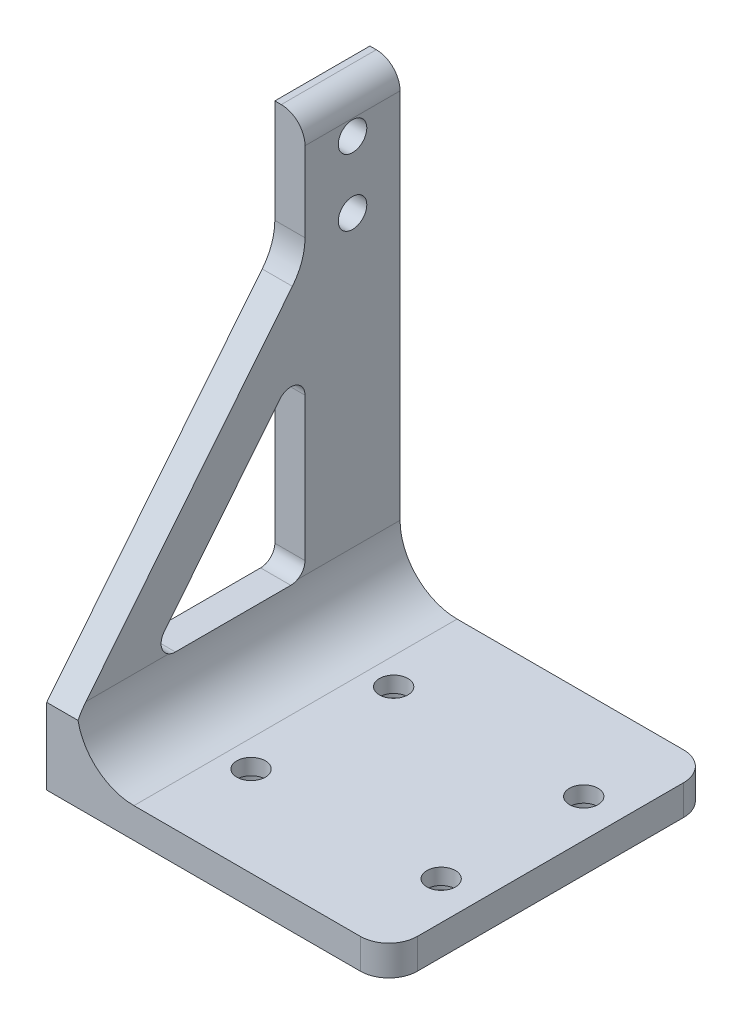
ISO-10303-21;
HEADER;
FILE_DESCRIPTION(('STEP AP214'),'2;1');
FILE_NAME('part.step','',(''),(''),'','','');
FILE_SCHEMA(('AUTOMOTIVE_DESIGN { 1 0 10303 214 1 1 1 1 }'));
ENDSEC;
DATA;
#1=APPLICATION_CONTEXT('core data for automotive mechanical design processes');
#2=APPLICATION_PROTOCOL_DEFINITION('international standard','automotive_design',2000,#1);
#3=PRODUCT_CONTEXT('',#1,'mechanical');
#4=PRODUCT('Part','Part','',(#3));
#5=PRODUCT_RELATED_PRODUCT_CATEGORY('part','',(#4));
#6=PRODUCT_DEFINITION_FORMATION('','',#4);
#7=PRODUCT_DEFINITION_CONTEXT('part definition',#1,'design');
#8=PRODUCT_DEFINITION('design','',#6,#7);
#9=PRODUCT_DEFINITION_SHAPE('','',#8);
#10=(LENGTH_UNIT() NAMED_UNIT(*) SI_UNIT(.MILLI.,.METRE.));
#11=(NAMED_UNIT(*) PLANE_ANGLE_UNIT() SI_UNIT($,.RADIAN.));
#12=(NAMED_UNIT(*) SI_UNIT($,.STERADIAN.) SOLID_ANGLE_UNIT());
#13=UNCERTAINTY_MEASURE_WITH_UNIT(LENGTH_MEASURE(1.E-05),#10,'distance_accuracy_value','');
#14=(GEOMETRIC_REPRESENTATION_CONTEXT(3) GLOBAL_UNCERTAINTY_ASSIGNED_CONTEXT((#13)) GLOBAL_UNIT_ASSIGNED_CONTEXT((#10,
#11,#12)) REPRESENTATION_CONTEXT('',''));
#15=CARTESIAN_POINT('',(0.,0.,0.));
#16=DIRECTION('',(0.,0.,1.));
#17=DIRECTION('',(1.,0.,0.));
#18=AXIS2_PLACEMENT_3D('',#15,#16,#17);
#19=CARTESIAN_POINT('',(0.,0.,-17.));
#20=DIRECTION('',(-1.,0.,0.));
#21=DIRECTION('',(0.,0.,1.));
#22=AXIS2_PLACEMENT_3D('',#19,#20,#21);
#23=PLANE('',#22);
#24=CARTESIAN_POINT('',(0.,39.6749994050729,-12.));
#25=DIRECTION('',(-1.,0.,0.));
#26=DIRECTION('',(0.,0.,1.));
#27=AXIS2_PLACEMENT_3D('',#24,#25,#26);
#28=CIRCLE('',#27,1.5);
#29=CARTESIAN_POINT('',(0.,39.6749994050729,-10.5));
#30=VERTEX_POINT('',#29);
#31=EDGE_CURVE('E477',#30,#30,#28,.T.);
#32=ORIENTED_EDGE('',*,*,#31,.F.);
#33=EDGE_LOOP('',(#32));
#34=FACE_BOUND('',#33,.T.);
#35=CARTESIAN_POINT('',(0.,46.6749994050729,-12.));
#36=DIRECTION('',(-1.,0.,0.));
#37=DIRECTION('',(0.,0.,1.));
#38=AXIS2_PLACEMENT_3D('',#35,#36,#37);
#39=CIRCLE('',#38,1.5);
#40=CARTESIAN_POINT('',(0.,46.6749994050729,-10.5));
#41=VERTEX_POINT('',#40);
#42=EDGE_CURVE('E474',#41,#41,#39,.T.);
#43=ORIENTED_EDGE('',*,*,#42,.F.);
#44=EDGE_LOOP('',(#43));
#45=FACE_BOUND('',#44,.T.);
#46=DIRECTION('',(0.,0.778824836888192,-0.627241479373041));
#47=VECTOR('',#46,1.);
#48=CARTESIAN_POINT('',(0.,29.8285884074539,-7.));
#49=LINE('',#48,#47);
#50=CARTESIAN_POINT('',(0.,11.4408622190596,7.8089069973646));
#51=VERTEX_POINT('',#50);
#52=CARTESIAN_POINT('',(0.,26.5155271487497,-4.33176274466771));
#53=VERTEX_POINT('',#52);
#54=EDGE_CURVE('E470',#51,#53,#49,.T.);
#55=ORIENTED_EDGE('',*,*,#54,.F.);
#56=CARTESIAN_POINT('',(0.,10.5,6.64066974203231));
#57=DIRECTION('',(-1.,0.,0.));
#58=DIRECTION('',(0.,0.,1.));
#59=AXIS2_PLACEMENT_3D('',#56,#57,#58);
#60=CIRCLE('',#59,1.5);
#61=CARTESIAN_POINT('',(0.,9.,6.64066974203231));
#62=VERTEX_POINT('',#61);
#63=EDGE_CURVE('E320',#51,#62,#60,.F.);
#64=ORIENTED_EDGE('',*,*,#63,.T.);
#65=DIRECTION('',(0.,0.,1.));
#66=VECTOR('',#65,1.);
#67=CARTESIAN_POINT('',(0.,9.,-7.));
#68=LINE('',#67,#66);
#69=CARTESIAN_POINT('',(0.,9.,-5.5));
#70=VERTEX_POINT('',#69);
#71=EDGE_CURVE('E464',#70,#62,#68,.T.);
#72=ORIENTED_EDGE('',*,*,#71,.F.);
#73=CARTESIAN_POINT('',(0.,10.5,-5.5));
#74=DIRECTION('',(-1.,0.,0.));
#75=DIRECTION('',(0.,0.,1.));
#76=AXIS2_PLACEMENT_3D('',#73,#74,#75);
#77=CIRCLE('',#76,1.5);
#78=CARTESIAN_POINT('',(0.,10.5,-7.));
#79=VERTEX_POINT('',#78);
#80=EDGE_CURVE('E501',#70,#79,#77,.F.);
#81=ORIENTED_EDGE('',*,*,#80,.T.);
#82=DIRECTION('',(0.,-1.,0.));
#83=VECTOR('',#82,1.);
#84=CARTESIAN_POINT('',(0.,29.8285884074539,-7.));
#85=LINE('',#84,#83);
#86=CARTESIAN_POINT('',(0.,25.5746649296901,-7.));
#87=VERTEX_POINT('',#86);
#88=EDGE_CURVE('E467',#87,#79,#85,.T.);
#89=ORIENTED_EDGE('',*,*,#88,.F.);
#90=CARTESIAN_POINT('',(0.,25.5746649296901,-5.5));
#91=DIRECTION('',(-1.,0.,0.));
#92=DIRECTION('',(0.,0.,1.));
#93=AXIS2_PLACEMENT_3D('',#90,#91,#92);
#94=CIRCLE('',#93,1.5);
#95=EDGE_CURVE('E316',#87,#53,#94,.F.);
#96=ORIENTED_EDGE('',*,*,#95,.T.);
#97=EDGE_LOOP('',(#55,#64,#72,#81,#89,#96));
#98=FACE_BOUND('',#97,.T.);
#99=DIRECTION('',(0.,-1.,0.));
#100=VECTOR('',#99,1.);
#101=CARTESIAN_POINT('',(0.,0.,17.));
#102=LINE('',#101,#100);
#103=CARTESIAN_POINT('',(0.,8.,17.));
#104=VERTEX_POINT('',#103);
#105=CARTESIAN_POINT('',(0.,0.,17.));
#106=VERTEX_POINT('',#105);
#107=EDGE_CURVE('E188',#104,#106,#102,.T.);
#108=ORIENTED_EDGE('',*,*,#107,.F.);
#109=DIRECTION('',(0.,-0.778824836888192,0.627241479373041));
#110=VECTOR('',#109,1.);
#111=CARTESIAN_POINT('',(0.,37.8,-7.));
#112=LINE('',#111,#110);
#113=CARTESIAN_POINT('',(0.,36.152245034817,-5.67294902132915));
#114=VERTEX_POINT('',#113);
#115=EDGE_CURVE('E170',#114,#104,#112,.T.);
#116=ORIENTED_EDGE('',*,*,#115,.F.);
#117=CARTESIAN_POINT('',(0.,39.9156939110553,-1.));
#118=DIRECTION('',(-1.,0.,0.));
#119=DIRECTION('',(0.,0.,1.));
#120=AXIS2_PLACEMENT_3D('',#117,#118,#119);
#121=CIRCLE('',#120,6.);
#122=CARTESIAN_POINT('',(0.,39.9156939110553,-7.));
#123=VERTEX_POINT('',#122);
#124=EDGE_CURVE('E296',#114,#123,#121,.F.);
#125=ORIENTED_EDGE('',*,*,#124,.T.);
#126=DIRECTION('',(0.,-1.,0.));
#127=VECTOR('',#126,1.);
#128=CARTESIAN_POINT('',(0.,50.8,-7.));
#129=LINE('',#128,#127);
#130=CARTESIAN_POINT('',(0.,50.8,-7.));
#131=VERTEX_POINT('',#130);
#132=EDGE_CURVE('E182',#131,#123,#129,.T.);
#133=ORIENTED_EDGE('',*,*,#132,.F.);
#134=DIRECTION('',(0.,0.,1.));
#135=VECTOR('',#134,1.);
#136=CARTESIAN_POINT('',(0.,50.8,-17.));
#137=LINE('',#136,#135);
#138=CARTESIAN_POINT('',(0.,50.8,-17.));
#139=VERTEX_POINT('',#138);
#140=EDGE_CURVE('E218',#139,#131,#137,.T.);
#141=ORIENTED_EDGE('',*,*,#140,.F.);
#142=DIRECTION('',(0.,-1.,0.));
#143=VECTOR('',#142,1.);
#144=CARTESIAN_POINT('',(0.,0.,-17.));
#145=LINE('',#144,#143);
#146=CARTESIAN_POINT('',(0.,0.,-17.));
#147=VERTEX_POINT('',#146);
#148=EDGE_CURVE('E213',#139,#147,#145,.T.);
#149=ORIENTED_EDGE('',*,*,#148,.T.);
#150=DIRECTION('',(0.,0.,1.));
#151=VECTOR('',#150,1.);
#152=CARTESIAN_POINT('',(0.,0.,-17.));
#153=LINE('',#152,#151);
#154=EDGE_CURVE('E195',#147,#106,#153,.T.);
#155=ORIENTED_EDGE('',*,*,#154,.T.);
#156=EDGE_LOOP('',(#108,#116,#125,#133,#141,#149,#155));
#157=FACE_BOUND('',#156,.T.);
#158=ADVANCED_FACE('F32',(#34,#45,#98,#157),#23,.T.);
#159=CARTESIAN_POINT('',(0.,50.8,-17.));
#160=DIRECTION('',(0.,1.,0.));
#161=DIRECTION('',(0.,0.,1.));
#162=AXIS2_PLACEMENT_3D('',#159,#160,#161);
#163=PLANE('',#162);
#164=ORIENTED_EDGE('',*,*,#140,.T.);
#165=DIRECTION('',(1.,0.,0.));
#166=VECTOR('',#165,1.);
#167=CARTESIAN_POINT('',(-103.676377914301,50.8,-7.));
#168=LINE('',#167,#166);
#169=CARTESIAN_POINT('',(0.674999999999967,50.8,-7.));
#170=VERTEX_POINT('',#169);
#171=EDGE_CURVE('E192',#131,#170,#168,.T.);
#172=ORIENTED_EDGE('',*,*,#171,.T.);
#173=DIRECTION('',(0.,0.,1.));
#174=VECTOR('',#173,1.);
#175=CARTESIAN_POINT('',(0.675,50.8,-17.));
#176=LINE('',#175,#174);
#177=CARTESIAN_POINT('',(0.675,50.8,-17.));
#178=VERTEX_POINT('',#177);
#179=EDGE_CURVE('E236',#170,#178,#176,.F.);
#180=ORIENTED_EDGE('',*,*,#179,.T.);
#181=DIRECTION('',(-1.,0.,0.));
#182=VECTOR('',#181,1.);
#183=CARTESIAN_POINT('',(0.,50.8,-17.));
#184=LINE('',#183,#182);
#185=EDGE_CURVE('E211',#178,#139,#184,.T.);
#186=ORIENTED_EDGE('',*,*,#185,.T.);
#187=EDGE_LOOP('',(#164,#172,#180,#186));
#188=FACE_BOUND('',#187,.T.);
#189=ADVANCED_FACE('F370',(#188),#163,.T.);
#190=CARTESIAN_POINT('',(3.175,3.175,-17.));
#191=DIRECTION('',(1.,0.,0.));
#192=DIRECTION('',(0.,0.,-1.));
#193=AXIS2_PLACEMENT_3D('',#190,#191,#192);
#194=PLANE('',#193);
#195=CARTESIAN_POINT('',(3.175,39.6749994050729,-12.));
#196=DIRECTION('',(1.,0.,0.));
#197=DIRECTION('',(0.,0.,-1.));
#198=AXIS2_PLACEMENT_3D('',#195,#196,#197);
#199=CIRCLE('',#198,1.5);
#200=CARTESIAN_POINT('',(3.175,39.6749994050729,-13.5));
#201=VERTEX_POINT('',#200);
#202=EDGE_CURVE('E37',#201,#201,#199,.T.);
#203=ORIENTED_EDGE('',*,*,#202,.F.);
#204=EDGE_LOOP('',(#203));
#205=FACE_BOUND('',#204,.T.);
#206=CARTESIAN_POINT('',(3.175,46.6749994050729,-12.));
#207=DIRECTION('',(1.,0.,0.));
#208=DIRECTION('',(0.,0.,-1.));
#209=AXIS2_PLACEMENT_3D('',#206,#207,#208);
#210=CIRCLE('',#209,1.5);
#211=CARTESIAN_POINT('',(3.175,46.6749994050729,-13.5));
#212=VERTEX_POINT('',#211);
#213=EDGE_CURVE('E473',#212,#212,#210,.T.);
#214=ORIENTED_EDGE('',*,*,#213,.F.);
#215=EDGE_LOOP('',(#214));
#216=FACE_BOUND('',#215,.T.);
#217=DIRECTION('',(0.,-0.778824836888192,0.627241479373041));
#218=VECTOR('',#217,1.);
#219=CARTESIAN_POINT('',(3.175,18.5464836498275,2.08625886520249));
#220=LINE('',#219,#218);
#221=CARTESIAN_POINT('',(3.175,26.5155271487497,-4.33176274466771));
#222=VERTEX_POINT('',#221);
#223=CARTESIAN_POINT('',(3.175,11.4408622190596,7.8089069973646));
#224=VERTEX_POINT('',#223);
#225=EDGE_CURVE('E456',#222,#224,#220,.T.);
#226=ORIENTED_EDGE('',*,*,#225,.F.);
#227=CARTESIAN_POINT('',(3.175,25.5746649296901,-5.5));
#228=DIRECTION('',(1.,0.,0.));
#229=DIRECTION('',(0.,0.,-1.));
#230=AXIS2_PLACEMENT_3D('',#227,#228,#229);
#231=CIRCLE('',#230,1.5);
#232=CARTESIAN_POINT('',(3.175,25.5746649296901,-7.));
#233=VERTEX_POINT('',#232);
#234=EDGE_CURVE('E318',#222,#233,#231,.F.);
#235=ORIENTED_EDGE('',*,*,#234,.T.);
#236=DIRECTION('',(0.,1.,0.));
#237=VECTOR('',#236,1.);
#238=CARTESIAN_POINT('',(3.175,3.175,-7.));
#239=LINE('',#238,#237);
#240=CARTESIAN_POINT('',(3.175,10.5,-7.));
#241=VERTEX_POINT('',#240);
#242=EDGE_CURVE('E461',#241,#233,#239,.T.);
#243=ORIENTED_EDGE('',*,*,#242,.F.);
#244=CARTESIAN_POINT('',(3.175,10.5,-5.5));
#245=DIRECTION('',(1.,0.,0.));
#246=DIRECTION('',(0.,0.,-1.));
#247=AXIS2_PLACEMENT_3D('',#244,#245,#246);
#248=CIRCLE('',#247,1.5);
#249=CARTESIAN_POINT('',(3.175,9.175,-6.20311805552126));
#250=VERTEX_POINT('',#249);
#251=EDGE_CURVE('E42',#241,#250,#248,.F.);
#252=ORIENTED_EDGE('',*,*,#251,.T.);
#253=DIRECTION('',(0.,0.,1.));
#254=VECTOR('',#253,1.);
#255=CARTESIAN_POINT('',(3.175,9.175,-17.));
#256=LINE('',#255,#254);
#257=CARTESIAN_POINT('',(3.175,9.175,-17.));
#258=VERTEX_POINT('',#257);
#259=EDGE_CURVE('E49',#250,#258,#256,.F.);
#260=ORIENTED_EDGE('',*,*,#259,.T.);
#261=DIRECTION('',(0.,1.,0.));
#262=VECTOR('',#261,1.);
#263=CARTESIAN_POINT('',(3.175,3.175,-17.));
#264=LINE('',#263,#262);
#265=CARTESIAN_POINT('',(3.175,48.3,-17.));
#266=VERTEX_POINT('',#265);
#267=EDGE_CURVE('E208',#258,#266,#264,.T.);
#268=ORIENTED_EDGE('',*,*,#267,.T.);
#269=DIRECTION('',(0.,0.,1.));
#270=VECTOR('',#269,1.);
#271=CARTESIAN_POINT('',(3.175,48.3,-17.));
#272=LINE('',#271,#270);
#273=CARTESIAN_POINT('',(3.175,48.3,-7.));
#274=VERTEX_POINT('',#273);
#275=EDGE_CURVE('E233',#266,#274,#272,.T.);
#276=ORIENTED_EDGE('',*,*,#275,.T.);
#277=DIRECTION('',(0.,-1.,0.));
#278=VECTOR('',#277,1.);
#279=CARTESIAN_POINT('',(3.175,3.175,-6.99999999999999));
#280=LINE('',#279,#278);
#281=CARTESIAN_POINT('',(3.175,39.9156939110553,-7.));
#282=VERTEX_POINT('',#281);
#283=EDGE_CURVE('E451',#274,#282,#280,.T.);
#284=ORIENTED_EDGE('',*,*,#283,.T.);
#285=CARTESIAN_POINT('',(3.175,39.9156939110553,-1.));
#286=DIRECTION('',(1.,0.,0.));
#287=DIRECTION('',(0.,0.,-1.));
#288=AXIS2_PLACEMENT_3D('',#285,#286,#287);
#289=CIRCLE('',#288,6.);
#290=CARTESIAN_POINT('',(3.175,36.152245034817,-5.67294902132915));
#291=VERTEX_POINT('',#290);
#292=EDGE_CURVE('E294',#282,#291,#289,.F.);
#293=ORIENTED_EDGE('',*,*,#292,.T.);
#294=DIRECTION('',(0.,-0.778824836888192,0.627241479373041));
#295=VECTOR('',#294,1.);
#296=CARTESIAN_POINT('',(3.175,21.6826910466927,5.98038304964345));
#297=LINE('',#296,#295);
#298=CARTESIAN_POINT('',(3.175,9.175,16.0536912751678));
#299=VERTEX_POINT('',#298);
#300=EDGE_CURVE('E440',#291,#299,#297,.T.);
#301=ORIENTED_EDGE('',*,*,#300,.T.);
#302=CARTESIAN_POINT('',(3.175,9.175,7.34378779755363));
#303=VERTEX_POINT('',#302);
#304=EDGE_CURVE('E57',#299,#303,#256,.F.);
#305=ORIENTED_EDGE('',*,*,#304,.T.);
#306=CARTESIAN_POINT('',(3.175,10.5,6.64066974203231));
#307=DIRECTION('',(1.,0.,0.));
#308=DIRECTION('',(0.,0.,-1.));
#309=AXIS2_PLACEMENT_3D('',#306,#307,#308);
#310=CIRCLE('',#309,1.5);
#311=EDGE_CURVE('E328',#303,#224,#310,.F.);
#312=ORIENTED_EDGE('',*,*,#311,.T.);
#313=EDGE_LOOP('',(#226,#235,#243,#252,#260,#268,#276,#284,#293,#301,#305,#312));
#314=FACE_BOUND('',#313,.T.);
#315=ADVANCED_FACE('F376',(#205,#216,#314),#194,.T.);
#316=CARTESIAN_POINT('',(0.,0.,17.));
#317=DIRECTION('',(0.,0.,1.));
#318=DIRECTION('',(1.,0.,0.));
#319=AXIS2_PLACEMENT_3D('',#316,#317,#318);
#320=PLANE('',#319);
#321=DIRECTION('',(1.,0.,0.));
#322=VECTOR('',#321,1.);
#323=CARTESIAN_POINT('',(0.,0.,17.));
#324=LINE('',#323,#322);
#325=CARTESIAN_POINT('',(33.,0.,17.));
#326=VERTEX_POINT('',#325);
#327=EDGE_CURVE('E203',#106,#326,#324,.T.);
#328=ORIENTED_EDGE('',*,*,#327,.T.);
#329=DIRECTION('',(0.,1.,0.));
#330=VECTOR('',#329,1.);
#331=CARTESIAN_POINT('',(33.,0.,17.));
#332=LINE('',#331,#330);
#333=CARTESIAN_POINT('',(33.,3.175,17.));
#334=VERTEX_POINT('',#333);
#335=EDGE_CURVE('E287',#326,#334,#332,.T.);
#336=ORIENTED_EDGE('',*,*,#335,.T.);
#337=DIRECTION('',(-1.,0.,0.));
#338=VECTOR('',#337,1.);
#339=CARTESIAN_POINT('',(3.175,3.175,17.));
#340=LINE('',#339,#338);
#341=CARTESIAN_POINT('',(9.175,3.175,17.));
#342=VERTEX_POINT('',#341);
#343=EDGE_CURVE('E198',#334,#342,#340,.T.);
#344=ORIENTED_EDGE('',*,*,#343,.T.);
#345=CARTESIAN_POINT('',(9.175,9.175,17.));
#346=DIRECTION('',(0.,0.,1.));
#347=DIRECTION('',(1.,0.,0.));
#348=AXIS2_PLACEMENT_3D('',#345,#346,#347);
#349=CIRCLE('',#348,6.);
#350=CARTESIAN_POINT('',(3.29117683814341,8.,17.));
#351=VERTEX_POINT('',#350);
#352=EDGE_CURVE('E191',#342,#351,#349,.F.);
#353=ORIENTED_EDGE('',*,*,#352,.T.);
#354=DIRECTION('',(1.,0.,0.));
#355=VECTOR('',#354,1.);
#356=CARTESIAN_POINT('',(-103.676377914301,8.,17.));
#357=LINE('',#356,#355);
#358=EDGE_CURVE('E175',#104,#351,#357,.T.);
#359=ORIENTED_EDGE('',*,*,#358,.F.);
#360=ORIENTED_EDGE('',*,*,#107,.T.);
#361=EDGE_LOOP('',(#328,#336,#344,#353,#359,#360));
#362=FACE_BOUND('',#361,.T.);
#363=ADVANCED_FACE('F187',(#362),#320,.T.);
#364=CARTESIAN_POINT('',(9.175,9.175,-17.));
#365=DIRECTION('',(0.,0.,-1.));
#366=DIRECTION('',(-1.,0.,0.));
#367=AXIS2_PLACEMENT_3D('',#364,#365,#366);
#368=CYLINDRICAL_SURFACE('',#367,6.);
#369=ORIENTED_EDGE('',*,*,#259,.F.);
#370=CARTESIAN_POINT('',(3.175,9.175,-6.20311805552126));
#371=CARTESIAN_POINT('',(3.17500145071679,9.15503001076075,-6.16548060358391));
#372=CARTESIAN_POINT('',(3.17509938942733,9.13667432534819,-6.12701820510613));
#373=CARTESIAN_POINT('',(3.17540509413307,9.1032922326386,-6.04865836708274));
#374=CARTESIAN_POINT('',(3.17561290105218,9.08826706886206,-6.00876039797736));
#375=CARTESIAN_POINT('',(3.17626678804146,9.04892250005548,-5.88899390782853));
#376=CARTESIAN_POINT('',(3.17675047274568,9.0294818561759,-5.80743759010175));
#377=CARTESIAN_POINT('',(3.17723042678405,9.01134011409029,-5.68789641267283));
#378=CARTESIAN_POINT('',(3.17734842314909,9.00711360072616,-5.650655796217));
#379=CARTESIAN_POINT('',(3.17751052579856,9.00143196734003,-5.57561930827016));
#380=CARTESIAN_POINT('',(3.17755394317767,9.00000266925612,-5.53782147899572));
#381=CARTESIAN_POINT('',(3.1775526263251,9.,-5.5));
#382=B_SPLINE_CURVE_WITH_KNOTS('',3,(#370,#371,#372,#373,#374,#375,#376,#377,#378,#379,#380,
#381),.UNSPECIFIED.,.F.,.F.,(4,2,2,2,2,4),(0.,0.127727456084482,0.255502521878572,
0.505640795183576,0.617998612886143,0.731388836392833),.UNSPECIFIED.);
#383=CARTESIAN_POINT('',(3.1775526263251,9.,-5.5));
#384=VERTEX_POINT('',#383);
#385=EDGE_CURVE('E11',#250,#384,#382,.T.);
#386=ORIENTED_EDGE('',*,*,#385,.T.);
#387=DIRECTION('',(0.,0.,-1.));
#388=VECTOR('',#387,1.);
#389=CARTESIAN_POINT('',(3.1775526263251,9.,-17.));
#390=LINE('',#389,#388);
#391=CARTESIAN_POINT('',(3.1775526263251,9.,6.64066974203231));
#392=VERTEX_POINT('',#391);
#393=EDGE_CURVE('E298',#384,#392,#390,.F.);
#394=ORIENTED_EDGE('',*,*,#393,.T.);
#395=CARTESIAN_POINT('',(3.1775526263251,9.,6.64066974203231));
#396=CARTESIAN_POINT('',(3.17755524271252,9.00000220015622,6.68327679782795));
#397=CARTESIAN_POINT('',(3.17749931275558,9.00181708722707,6.72585609912429));
#398=CARTESIAN_POINT('',(3.17729348031295,9.00906040652486,6.81072179512134));
#399=CARTESIAN_POINT('',(3.17714354298612,9.01449017855181,6.85300807534473));
#400=CARTESIAN_POINT('',(3.17659534999809,9.03587584207721,6.97724469635942));
#401=CARTESIAN_POINT('',(3.17609679894531,9.05693246349137,7.05839873394656));
#402=CARTESIAN_POINT('',(3.17549560600288,9.09694151008646,7.17249696084514));
#403=CARTESIAN_POINT('',(3.17532615055095,9.11066441580667,7.2073739077844));
#404=CARTESIAN_POINT('',(3.17507825514349,9.14081861307184,7.27631930980708));
#405=CARTESIAN_POINT('',(3.17500066579183,9.15727363204401,7.31037739143662));
#406=CARTESIAN_POINT('',(3.175,9.17500000000002,7.34378779755362));
#407=B_SPLINE_CURVE_WITH_KNOTS('',3,(#395,#396,#397,#398,#399,#400,#401,#402,#403,#404,#405,
#406),.UNSPECIFIED.,.F.,.F.,(4,2,2,2,2,4),(0.,0.127727251653594,0.255501869770539,
0.505640213049169,0.617998331021459,0.73138885287978),.UNSPECIFIED.);
#408=EDGE_CURVE('E322',#392,#303,#407,.T.);
#409=ORIENTED_EDGE('',*,*,#408,.T.);
#410=ORIENTED_EDGE('',*,*,#304,.F.);
#411=CARTESIAN_POINT('',(9.175,9.175,16.0536912751678));
#412=DIRECTION('',(0.,0.627241479373041,0.778824836888192));
#413=DIRECTION('',(0.,0.778824836888192,-0.627241479373041));
#414=AXIS2_PLACEMENT_3D('',#411,#412,#413);
#415=ELLIPSE('',#414,7.70391455923915,6.);
#416=EDGE_CURVE('E270',#351,#299,#415,.F.);
#417=ORIENTED_EDGE('',*,*,#416,.F.);
#418=ORIENTED_EDGE('',*,*,#352,.F.);
#419=DIRECTION('',(0.,0.,1.));
#420=VECTOR('',#419,1.);
#421=CARTESIAN_POINT('',(9.175,3.175,17.));
#422=LINE('',#421,#420);
#423=CARTESIAN_POINT('',(9.175,3.175,-17.));
#424=VERTEX_POINT('',#423);
#425=EDGE_CURVE('E217',#424,#342,#422,.T.);
#426=ORIENTED_EDGE('',*,*,#425,.F.);
#427=CARTESIAN_POINT('',(9.175,9.175,-17.));
#428=DIRECTION('',(0.,0.,1.));
#429=DIRECTION('',(1.,0.,0.));
#430=AXIS2_PLACEMENT_3D('',#427,#428,#429);
#431=CIRCLE('',#430,6.);
#432=EDGE_CURVE('E230',#258,#424,#431,.T.);
#433=ORIENTED_EDGE('',*,*,#432,.F.);
#434=EDGE_LOOP('',(#369,#386,#394,#409,#410,#417,#418,#426,#433));
#435=FACE_BOUND('',#434,.T.);
#436=ADVANCED_FACE('F330',(#435),#368,.F.);
#437=CARTESIAN_POINT('',(0.675,48.3,-17.));
#438=DIRECTION('',(0.,0.,1.));
#439=DIRECTION('',(1.,0.,0.));
#440=AXIS2_PLACEMENT_3D('',#437,#438,#439);
#441=CYLINDRICAL_SURFACE('',#440,2.5);
#442=ORIENTED_EDGE('',*,*,#179,.F.);
#443=CARTESIAN_POINT('',(0.675,48.3,-7.));
#444=DIRECTION('',(0.,0.,1.));
#445=DIRECTION('',(0.,-1.,0.));
#446=AXIS2_PLACEMENT_3D('',#443,#444,#445);
#447=CIRCLE('',#446,2.5);
#448=EDGE_CURVE('E240',#170,#274,#447,.F.);
#449=ORIENTED_EDGE('',*,*,#448,.T.);
#450=ORIENTED_EDGE('',*,*,#275,.F.);
#451=CARTESIAN_POINT('',(0.675,48.3,-17.));
#452=DIRECTION('',(0.,0.,1.));
#453=DIRECTION('',(1.,0.,0.));
#454=AXIS2_PLACEMENT_3D('',#451,#452,#453);
#455=CIRCLE('',#454,2.5);
#456=EDGE_CURVE('E238',#178,#266,#455,.F.);
#457=ORIENTED_EDGE('',*,*,#456,.F.);
#458=EDGE_LOOP('',(#442,#449,#450,#457));
#459=FACE_BOUND('',#458,.T.);
#460=ADVANCED_FACE('F357',(#459),#441,.T.);
#461=CARTESIAN_POINT('',(12.,10.,-7.50000000000001));
#462=DIRECTION('',(0.,-1.,0.));
#463=DIRECTION('',(0.,0.,-1.));
#464=AXIS2_PLACEMENT_3D('',#461,#462,#463);
#465=CYLINDRICAL_SURFACE('',#464,1.5);
#466=CARTESIAN_POINT('',(12.,3.175,-7.50000000000001));
#467=DIRECTION('',(0.,1.,0.));
#468=DIRECTION('',(0.,0.,1.));
#469=AXIS2_PLACEMENT_3D('',#466,#467,#468);
#470=CIRCLE('',#469,1.5);
#471=CARTESIAN_POINT('',(12.,3.175,-6.00000000000001));
#472=VERTEX_POINT('',#471);
#473=EDGE_CURVE('E241',#472,#472,#470,.T.);
#474=ORIENTED_EDGE('',*,*,#473,.T.);
#475=EDGE_LOOP('',(#474));
#476=FACE_BOUND('',#475,.T.);
#477=CARTESIAN_POINT('',(12.,1.5,-7.50000000000001));
#478=DIRECTION('',(0.,-1.,0.));
#479=DIRECTION('',(0.,0.,-1.));
#480=AXIS2_PLACEMENT_3D('',#477,#478,#479);
#481=CIRCLE('',#480,1.5);
#482=CARTESIAN_POINT('',(12.,1.5,-9.00000000000001));
#483=VERTEX_POINT('',#482);
#484=EDGE_CURVE('E264',#483,#483,#481,.F.);
#485=ORIENTED_EDGE('',*,*,#484,.F.);
#486=EDGE_LOOP('',(#485));
#487=FACE_BOUND('',#486,.T.);
#488=ADVANCED_FACE('F359',(#476,#487),#465,.F.);
#489=CARTESIAN_POINT('',(32.,10.,7.49999999999999));
#490=DIRECTION('',(0.,-1.,0.));
#491=DIRECTION('',(0.,0.,-1.));
#492=AXIS2_PLACEMENT_3D('',#489,#490,#491);
#493=CYLINDRICAL_SURFACE('',#492,1.5);
#494=CARTESIAN_POINT('',(32.,3.175,7.49999999999999));
#495=DIRECTION('',(0.,1.,0.));
#496=DIRECTION('',(0.,0.,1.));
#497=AXIS2_PLACEMENT_3D('',#494,#495,#496);
#498=CIRCLE('',#497,1.5);
#499=CARTESIAN_POINT('',(32.,3.175,9.));
#500=VERTEX_POINT('',#499);
#501=EDGE_CURVE('E245',#500,#500,#498,.T.);
#502=ORIENTED_EDGE('',*,*,#501,.T.);
#503=EDGE_LOOP('',(#502));
#504=FACE_BOUND('',#503,.T.);
#505=CARTESIAN_POINT('',(32.,1.5,7.49999999999999));
#506=DIRECTION('',(0.,-1.,0.));
#507=DIRECTION('',(0.,0.,-1.));
#508=AXIS2_PLACEMENT_3D('',#505,#506,#507);
#509=CIRCLE('',#508,1.5);
#510=CARTESIAN_POINT('',(32.,1.5,5.99999999999999));
#511=VERTEX_POINT('',#510);
#512=EDGE_CURVE('E260',#511,#511,#509,.F.);
#513=ORIENTED_EDGE('',*,*,#512,.F.);
#514=EDGE_LOOP('',(#513));
#515=FACE_BOUND('',#514,.T.);
#516=ADVANCED_FACE('F365',(#504,#515),#493,.F.);
#517=CARTESIAN_POINT('',(32.,10.,-7.50000000000001));
#518=DIRECTION('',(0.,-1.,0.));
#519=DIRECTION('',(0.,0.,-1.));
#520=AXIS2_PLACEMENT_3D('',#517,#518,#519);
#521=CYLINDRICAL_SURFACE('',#520,1.5);
#522=CARTESIAN_POINT('',(32.,3.175,-7.50000000000001));
#523=DIRECTION('',(0.,1.,0.));
#524=DIRECTION('',(0.,0.,1.));
#525=AXIS2_PLACEMENT_3D('',#522,#523,#524);
#526=CIRCLE('',#525,1.5);
#527=CARTESIAN_POINT('',(32.,3.175,-6.00000000000001));
#528=VERTEX_POINT('',#527);
#529=EDGE_CURVE('E248',#528,#528,#526,.T.);
#530=ORIENTED_EDGE('',*,*,#529,.T.);
#531=EDGE_LOOP('',(#530));
#532=FACE_BOUND('',#531,.T.);
#533=CARTESIAN_POINT('',(32.,1.5,-7.50000000000001));
#534=DIRECTION('',(0.,-1.,0.));
#535=DIRECTION('',(0.,0.,-1.));
#536=AXIS2_PLACEMENT_3D('',#533,#534,#535);
#537=CIRCLE('',#536,1.5);
#538=CARTESIAN_POINT('',(32.,1.5,-9.));
#539=VERTEX_POINT('',#538);
#540=EDGE_CURVE('E257',#539,#539,#537,.F.);
#541=ORIENTED_EDGE('',*,*,#540,.F.);
#542=EDGE_LOOP('',(#541));
#543=FACE_BOUND('',#542,.T.);
#544=ADVANCED_FACE('F402',(#532,#543),#521,.F.);
#545=CARTESIAN_POINT('',(12.,10.,7.49999999999999));
#546=DIRECTION('',(0.,-1.,0.));
#547=DIRECTION('',(0.,0.,-1.));
#548=AXIS2_PLACEMENT_3D('',#545,#546,#547);
#549=CYLINDRICAL_SURFACE('',#548,1.5);
#550=CARTESIAN_POINT('',(12.,3.175,7.49999999999999));
#551=DIRECTION('',(0.,1.,0.));
#552=DIRECTION('',(0.,0.,1.));
#553=AXIS2_PLACEMENT_3D('',#550,#551,#552);
#554=CIRCLE('',#553,1.5);
#555=CARTESIAN_POINT('',(12.,3.175,8.99999999999999));
#556=VERTEX_POINT('',#555);
#557=EDGE_CURVE('E244',#556,#556,#554,.T.);
#558=ORIENTED_EDGE('',*,*,#557,.T.);
#559=EDGE_LOOP('',(#558));
#560=FACE_BOUND('',#559,.T.);
#561=CARTESIAN_POINT('',(12.,1.5,7.49999999999999));
#562=DIRECTION('',(0.,-1.,0.));
#563=DIRECTION('',(0.,0.,-1.));
#564=AXIS2_PLACEMENT_3D('',#561,#562,#563);
#565=CIRCLE('',#564,1.5);
#566=CARTESIAN_POINT('',(12.,1.5,6.));
#567=VERTEX_POINT('',#566);
#568=EDGE_CURVE('E249',#567,#567,#565,.F.);
#569=ORIENTED_EDGE('',*,*,#568,.F.);
#570=EDGE_LOOP('',(#569));
#571=FACE_BOUND('',#570,.T.);
#572=ADVANCED_FACE('F397',(#560,#571),#549,.F.);
#573=CARTESIAN_POINT('',(0.,0.,-17.));
#574=DIRECTION('',(0.,-1.,0.));
#575=DIRECTION('',(0.,0.,-1.));
#576=AXIS2_PLACEMENT_3D('',#573,#574,#575);
#577=PLANE('',#576);
#578=CARTESIAN_POINT('',(32.,0.,7.49999999999999));
#579=DIRECTION('',(0.,-1.,0.));
#580=DIRECTION('',(0.,0.,-1.));
#581=AXIS2_PLACEMENT_3D('',#578,#579,#580);
#582=CIRCLE('',#581,3.025);
#583=CARTESIAN_POINT('',(32.,0.,4.47499999999999));
#584=VERTEX_POINT('',#583);
#585=EDGE_CURVE('E408',#584,#584,#582,.T.);
#586=ORIENTED_EDGE('',*,*,#585,.F.);
#587=EDGE_LOOP('',(#586));
#588=FACE_BOUND('',#587,.T.);
#589=CARTESIAN_POINT('',(12.,0.,-7.50000000000001));
#590=DIRECTION('',(0.,-1.,0.));
#591=DIRECTION('',(0.,0.,-1.));
#592=AXIS2_PLACEMENT_3D('',#589,#590,#591);
#593=CIRCLE('',#592,3.025);
#594=CARTESIAN_POINT('',(12.,0.,-10.525));
#595=VERTEX_POINT('',#594);
#596=EDGE_CURVE('E412',#595,#595,#593,.T.);
#597=ORIENTED_EDGE('',*,*,#596,.F.);
#598=EDGE_LOOP('',(#597));
#599=FACE_BOUND('',#598,.T.);
#600=CARTESIAN_POINT('',(32.,0.,-7.50000000000001));
#601=DIRECTION('',(0.,-1.,0.));
#602=DIRECTION('',(0.,0.,-1.));
#603=AXIS2_PLACEMENT_3D('',#600,#601,#602);
#604=CIRCLE('',#603,3.025);
#605=CARTESIAN_POINT('',(32.,0.,-10.525));
#606=VERTEX_POINT('',#605);
#607=EDGE_CURVE('E416',#606,#606,#604,.T.);
#608=ORIENTED_EDGE('',*,*,#607,.F.);
#609=EDGE_LOOP('',(#608));
#610=FACE_BOUND('',#609,.T.);
#611=CARTESIAN_POINT('',(12.,0.,7.49999999999999));
#612=DIRECTION('',(0.,-1.,0.));
#613=DIRECTION('',(0.,0.,-1.));
#614=AXIS2_PLACEMENT_3D('',#611,#612,#613);
#615=CIRCLE('',#614,3.025);
#616=CARTESIAN_POINT('',(12.,0.,4.475));
#617=VERTEX_POINT('',#616);
#618=EDGE_CURVE('E267',#617,#617,#615,.T.);
#619=ORIENTED_EDGE('',*,*,#618,.F.);
#620=EDGE_LOOP('',(#619));
#621=FACE_BOUND('',#620,.T.);
#622=DIRECTION('',(1.,0.,0.));
#623=VECTOR('',#622,1.);
#624=CARTESIAN_POINT('',(0.,0.,-17.));
#625=LINE('',#624,#623);
#626=CARTESIAN_POINT('',(33.,0.,-17.));
#627=VERTEX_POINT('',#626);
#628=EDGE_CURVE('E197',#147,#627,#625,.T.);
#629=ORIENTED_EDGE('',*,*,#628,.T.);
#630=CARTESIAN_POINT('',(33.,0.,-14.));
#631=DIRECTION('',(0.,-1.,0.));
#632=DIRECTION('',(0.,0.,-1.));
#633=AXIS2_PLACEMENT_3D('',#630,#631,#632);
#634=CIRCLE('',#633,3.);
#635=CARTESIAN_POINT('',(36.,0.,-14.));
#636=VERTEX_POINT('',#635);
#637=EDGE_CURVE('E285',#627,#636,#634,.T.);
#638=ORIENTED_EDGE('',*,*,#637,.T.);
#639=DIRECTION('',(0.,0.,1.));
#640=VECTOR('',#639,1.);
#641=CARTESIAN_POINT('',(36.,0.,-17.));
#642=LINE('',#641,#640);
#643=CARTESIAN_POINT('',(36.,0.,14.));
#644=VERTEX_POINT('',#643);
#645=EDGE_CURVE('E215',#636,#644,#642,.T.);
#646=ORIENTED_EDGE('',*,*,#645,.T.);
#647=CARTESIAN_POINT('',(33.,0.,14.));
#648=DIRECTION('',(0.,-1.,0.));
#649=DIRECTION('',(0.,0.,-1.));
#650=AXIS2_PLACEMENT_3D('',#647,#648,#649);
#651=CIRCLE('',#650,3.);
#652=EDGE_CURVE('E283',#644,#326,#651,.T.);
#653=ORIENTED_EDGE('',*,*,#652,.T.);
#654=ORIENTED_EDGE('',*,*,#327,.F.);
#655=ORIENTED_EDGE('',*,*,#154,.F.);
#656=EDGE_LOOP('',(#629,#638,#646,#653,#654,#655));
#657=FACE_BOUND('',#656,.T.);
#658=ADVANCED_FACE('F392',(#588,#599,#610,#621,#657),#577,.T.);
#659=CARTESIAN_POINT('',(3.175,3.175,-17.));
#660=DIRECTION('',(0.,1.,0.));
#661=DIRECTION('',(0.,0.,1.));
#662=AXIS2_PLACEMENT_3D('',#659,#660,#661);
#663=PLANE('',#662);
#664=ORIENTED_EDGE('',*,*,#557,.F.);
#665=EDGE_LOOP('',(#664));
#666=FACE_BOUND('',#665,.T.);
#667=ORIENTED_EDGE('',*,*,#529,.F.);
#668=EDGE_LOOP('',(#667));
#669=FACE_BOUND('',#668,.T.);
#670=ORIENTED_EDGE('',*,*,#501,.F.);
#671=EDGE_LOOP('',(#670));
#672=FACE_BOUND('',#671,.T.);
#673=ORIENTED_EDGE('',*,*,#473,.F.);
#674=EDGE_LOOP('',(#673));
#675=FACE_BOUND('',#674,.T.);
#676=DIRECTION('',(0.,0.,1.));
#677=VECTOR('',#676,1.);
#678=CARTESIAN_POINT('',(36.,3.175,-17.));
#679=LINE('',#678,#677);
#680=CARTESIAN_POINT('',(36.,3.175,-14.));
#681=VERTEX_POINT('',#680);
#682=CARTESIAN_POINT('',(36.,3.175,14.));
#683=VERTEX_POINT('',#682);
#684=EDGE_CURVE('E221',#681,#683,#679,.T.);
#685=ORIENTED_EDGE('',*,*,#684,.F.);
#686=CARTESIAN_POINT('',(33.,3.175,-14.));
#687=DIRECTION('',(0.,1.,0.));
#688=DIRECTION('',(0.,0.,1.));
#689=AXIS2_PLACEMENT_3D('',#686,#687,#688);
#690=CIRCLE('',#689,3.);
#691=CARTESIAN_POINT('',(33.,3.175,-17.));
#692=VERTEX_POINT('',#691);
#693=EDGE_CURVE('E279',#681,#692,#690,.T.);
#694=ORIENTED_EDGE('',*,*,#693,.T.);
#695=DIRECTION('',(-1.,0.,0.));
#696=VECTOR('',#695,1.);
#697=CARTESIAN_POINT('',(3.175,3.175,-17.));
#698=LINE('',#697,#696);
#699=EDGE_CURVE('E201',#692,#424,#698,.T.);
#700=ORIENTED_EDGE('',*,*,#699,.T.);
#701=ORIENTED_EDGE('',*,*,#425,.T.);
#702=ORIENTED_EDGE('',*,*,#343,.F.);
#703=CARTESIAN_POINT('',(33.,3.175,14.));
#704=DIRECTION('',(0.,1.,0.));
#705=DIRECTION('',(0.,0.,1.));
#706=AXIS2_PLACEMENT_3D('',#703,#704,#705);
#707=CIRCLE('',#706,3.);
#708=EDGE_CURVE('E277',#334,#683,#707,.T.);
#709=ORIENTED_EDGE('',*,*,#708,.T.);
#710=EDGE_LOOP('',(#685,#694,#700,#701,#702,#709));
#711=FACE_BOUND('',#710,.T.);
#712=ADVANCED_FACE('F388',(#666,#669,#672,#675,#711),#663,.T.);
#713=CARTESIAN_POINT('',(36.,0.,-17.));
#714=DIRECTION('',(1.,0.,0.));
#715=DIRECTION('',(0.,0.,-1.));
#716=AXIS2_PLACEMENT_3D('',#713,#714,#715);
#717=PLANE('',#716);
#718=ORIENTED_EDGE('',*,*,#645,.F.);
#719=DIRECTION('',(0.,1.,0.));
#720=VECTOR('',#719,1.);
#721=CARTESIAN_POINT('',(36.,3.175,-14.));
#722=LINE('',#721,#720);
#723=EDGE_CURVE('E274',#636,#681,#722,.T.);
#724=ORIENTED_EDGE('',*,*,#723,.T.);
#725=ORIENTED_EDGE('',*,*,#684,.T.);
#726=DIRECTION('',(0.,1.,0.));
#727=VECTOR('',#726,1.);
#728=CARTESIAN_POINT('',(36.,0.,14.));
#729=LINE('',#728,#727);
#730=EDGE_CURVE('E272',#683,#644,#729,.F.);
#731=ORIENTED_EDGE('',*,*,#730,.T.);
#732=EDGE_LOOP('',(#718,#724,#725,#731));
#733=FACE_BOUND('',#732,.T.);
#734=ADVANCED_FACE('F391',(#733),#717,.T.);
#735=CARTESIAN_POINT('',(0.,0.,-17.));
#736=DIRECTION('',(0.,0.,1.));
#737=DIRECTION('',(1.,0.,0.));
#738=AXIS2_PLACEMENT_3D('',#735,#736,#737);
#739=PLANE('',#738);
#740=ORIENTED_EDGE('',*,*,#699,.F.);
#741=DIRECTION('',(0.,1.,0.));
#742=VECTOR('',#741,1.);
#743=CARTESIAN_POINT('',(33.,0.,-17.));
#744=LINE('',#743,#742);
#745=EDGE_CURVE('E281',#692,#627,#744,.F.);
#746=ORIENTED_EDGE('',*,*,#745,.T.);
#747=ORIENTED_EDGE('',*,*,#628,.F.);
#748=ORIENTED_EDGE('',*,*,#148,.F.);
#749=ORIENTED_EDGE('',*,*,#185,.F.);
#750=ORIENTED_EDGE('',*,*,#456,.T.);
#751=ORIENTED_EDGE('',*,*,#267,.F.);
#752=ORIENTED_EDGE('',*,*,#432,.T.);
#753=EDGE_LOOP('',(#740,#746,#747,#748,#749,#750,#751,#752));
#754=FACE_BOUND('',#753,.T.);
#755=ADVANCED_FACE('F382',(#754),#739,.F.);
#756=CARTESIAN_POINT('',(12.,1.5,7.49999999999999));
#757=DIRECTION('',(0.,-1.,0.));
#758=DIRECTION('',(0.,0.,-1.));
#759=AXIS2_PLACEMENT_3D('',#756,#757,#758);
#760=PLANE('',#759);
#761=CARTESIAN_POINT('',(12.,1.5,7.49999999999999));
#762=DIRECTION('',(0.,-1.,0.));
#763=DIRECTION('',(0.,0.,-1.));
#764=AXIS2_PLACEMENT_3D('',#761,#762,#763);
#765=CIRCLE('',#764,3.025);
#766=CARTESIAN_POINT('',(12.,1.5,4.475));
#767=VERTEX_POINT('',#766);
#768=EDGE_CURVE('E256',#767,#767,#765,.T.);
#769=ORIENTED_EDGE('',*,*,#768,.T.);
#770=EDGE_LOOP('',(#769));
#771=FACE_BOUND('',#770,.T.);
#772=ORIENTED_EDGE('',*,*,#568,.T.);
#773=EDGE_LOOP('',(#772));
#774=FACE_BOUND('',#773,.T.);
#775=ADVANCED_FACE('F558',(#771,#774),#760,.T.);
#776=CARTESIAN_POINT('',(12.,1.5,7.49999999999999));
#777=DIRECTION('',(0.,-1.,0.));
#778=DIRECTION('',(0.,0.,-1.));
#779=AXIS2_PLACEMENT_3D('',#776,#777,#778);
#780=CYLINDRICAL_SURFACE('',#779,3.025);
#781=ORIENTED_EDGE('',*,*,#768,.F.);
#782=EDGE_LOOP('',(#781));
#783=FACE_BOUND('',#782,.T.);
#784=ORIENTED_EDGE('',*,*,#618,.T.);
#785=EDGE_LOOP('',(#784));
#786=FACE_BOUND('',#785,.T.);
#787=ADVANCED_FACE('F553',(#783,#786),#780,.F.);
#788=CARTESIAN_POINT('',(32.,1.5,-7.50000000000001));
#789=DIRECTION('',(0.,-1.,0.));
#790=DIRECTION('',(0.,0.,-1.));
#791=AXIS2_PLACEMENT_3D('',#788,#789,#790);
#792=PLANE('',#791);
#793=CARTESIAN_POINT('',(32.,1.5,-7.50000000000001));
#794=DIRECTION('',(0.,-1.,0.));
#795=DIRECTION('',(0.,0.,-1.));
#796=AXIS2_PLACEMENT_3D('',#793,#794,#795);
#797=CIRCLE('',#796,3.025);
#798=CARTESIAN_POINT('',(32.,1.5,-10.525));
#799=VERTEX_POINT('',#798);
#800=EDGE_CURVE('E439',#799,#799,#797,.T.);
#801=ORIENTED_EDGE('',*,*,#800,.T.);
#802=EDGE_LOOP('',(#801));
#803=FACE_BOUND('',#802,.T.);
#804=ORIENTED_EDGE('',*,*,#540,.T.);
#805=EDGE_LOOP('',(#804));
#806=FACE_BOUND('',#805,.T.);
#807=ADVANCED_FACE('F550',(#803,#806),#792,.T.);
#808=CARTESIAN_POINT('',(32.,1.5,-7.50000000000001));
#809=DIRECTION('',(0.,-1.,0.));
#810=DIRECTION('',(0.,0.,-1.));
#811=AXIS2_PLACEMENT_3D('',#808,#809,#810);
#812=CYLINDRICAL_SURFACE('',#811,3.025);
#813=ORIENTED_EDGE('',*,*,#800,.F.);
#814=EDGE_LOOP('',(#813));
#815=FACE_BOUND('',#814,.T.);
#816=ORIENTED_EDGE('',*,*,#607,.T.);
#817=EDGE_LOOP('',(#816));
#818=FACE_BOUND('',#817,.T.);
#819=ADVANCED_FACE('F538',(#815,#818),#812,.F.);
#820=CARTESIAN_POINT('',(32.,1.5,7.49999999999999));
#821=DIRECTION('',(0.,-1.,0.));
#822=DIRECTION('',(0.,0.,-1.));
#823=AXIS2_PLACEMENT_3D('',#820,#821,#822);
#824=PLANE('',#823);
#825=CARTESIAN_POINT('',(32.,1.5,7.49999999999999));
#826=DIRECTION('',(0.,-1.,0.));
#827=DIRECTION('',(0.,0.,-1.));
#828=AXIS2_PLACEMENT_3D('',#825,#826,#827);
#829=CIRCLE('',#828,3.025);
#830=CARTESIAN_POINT('',(32.,1.5,4.47499999999999));
#831=VERTEX_POINT('',#830);
#832=EDGE_CURVE('E261',#831,#831,#829,.T.);
#833=ORIENTED_EDGE('',*,*,#832,.T.);
#834=EDGE_LOOP('',(#833));
#835=FACE_BOUND('',#834,.T.);
#836=ORIENTED_EDGE('',*,*,#512,.T.);
#837=EDGE_LOOP('',(#836));
#838=FACE_BOUND('',#837,.T.);
#839=ADVANCED_FACE('F534',(#835,#838),#824,.T.);
#840=CARTESIAN_POINT('',(32.,1.5,7.49999999999999));
#841=DIRECTION('',(0.,-1.,0.));
#842=DIRECTION('',(0.,0.,-1.));
#843=AXIS2_PLACEMENT_3D('',#840,#841,#842);
#844=CYLINDRICAL_SURFACE('',#843,3.025);
#845=ORIENTED_EDGE('',*,*,#832,.F.);
#846=EDGE_LOOP('',(#845));
#847=FACE_BOUND('',#846,.T.);
#848=ORIENTED_EDGE('',*,*,#585,.T.);
#849=EDGE_LOOP('',(#848));
#850=FACE_BOUND('',#849,.T.);
#851=ADVANCED_FACE('F537',(#847,#850),#844,.F.);
#852=CARTESIAN_POINT('',(12.,1.5,-7.50000000000001));
#853=DIRECTION('',(0.,-1.,0.));
#854=DIRECTION('',(0.,0.,-1.));
#855=AXIS2_PLACEMENT_3D('',#852,#853,#854);
#856=PLANE('',#855);
#857=CARTESIAN_POINT('',(12.,1.5,-7.50000000000001));
#858=DIRECTION('',(0.,-1.,0.));
#859=DIRECTION('',(0.,0.,-1.));
#860=AXIS2_PLACEMENT_3D('',#857,#858,#859);
#861=CIRCLE('',#860,3.025);
#862=CARTESIAN_POINT('',(12.,1.5,-10.525));
#863=VERTEX_POINT('',#862);
#864=EDGE_CURVE('E444',#863,#863,#861,.T.);
#865=ORIENTED_EDGE('',*,*,#864,.T.);
#866=EDGE_LOOP('',(#865));
#867=FACE_BOUND('',#866,.T.);
#868=ORIENTED_EDGE('',*,*,#484,.T.);
#869=EDGE_LOOP('',(#868));
#870=FACE_BOUND('',#869,.T.);
#871=ADVANCED_FACE('F542',(#867,#870),#856,.T.);
#872=CARTESIAN_POINT('',(12.,1.5,-7.50000000000001));
#873=DIRECTION('',(0.,-1.,0.));
#874=DIRECTION('',(0.,0.,-1.));
#875=AXIS2_PLACEMENT_3D('',#872,#873,#874);
#876=CYLINDRICAL_SURFACE('',#875,3.025);
#877=ORIENTED_EDGE('',*,*,#864,.F.);
#878=EDGE_LOOP('',(#877));
#879=FACE_BOUND('',#878,.T.);
#880=ORIENTED_EDGE('',*,*,#596,.T.);
#881=EDGE_LOOP('',(#880));
#882=FACE_BOUND('',#881,.T.);
#883=ADVANCED_FACE('F530',(#879,#882),#876,.F.);
#884=CARTESIAN_POINT('',(-103.676377914301,37.8,-7.));
#885=DIRECTION('',(0.,0.627241479373041,0.778824836888192));
#886=DIRECTION('',(0.,-0.778824836888192,0.627241479373041));
#887=AXIS2_PLACEMENT_3D('',#884,#885,#886);
#888=PLANE('',#887);
#889=ORIENTED_EDGE('',*,*,#300,.F.);
#890=DIRECTION('',(1.,0.,0.));
#891=VECTOR('',#890,1.);
#892=CARTESIAN_POINT('',(0.,36.152245034817,-5.67294902132915));
#893=LINE('',#892,#891);
#894=EDGE_CURVE('E178',#291,#114,#893,.F.);
#895=ORIENTED_EDGE('',*,*,#894,.T.);
#896=ORIENTED_EDGE('',*,*,#115,.T.);
#897=ORIENTED_EDGE('',*,*,#358,.T.);
#898=ORIENTED_EDGE('',*,*,#416,.T.);
#899=EDGE_LOOP('',(#889,#895,#896,#897,#898));
#900=FACE_BOUND('',#899,.T.);
#901=ADVANCED_FACE('F173',(#900),#888,.T.);
#902=CARTESIAN_POINT('',(-103.676377914301,50.8,-7.));
#903=DIRECTION('',(0.,0.,1.));
#904=DIRECTION('',(0.,-1.,0.));
#905=AXIS2_PLACEMENT_3D('',#902,#903,#904);
#906=PLANE('',#905);
#907=ORIENTED_EDGE('',*,*,#132,.T.);
#908=DIRECTION('',(1.,0.,0.));
#909=VECTOR('',#908,1.);
#910=CARTESIAN_POINT('',(3.17499999999997,39.9156939110553,-7.));
#911=LINE('',#910,#909);
#912=EDGE_CURVE('E290',#123,#282,#911,.T.);
#913=ORIENTED_EDGE('',*,*,#912,.T.);
#914=ORIENTED_EDGE('',*,*,#283,.F.);
#915=ORIENTED_EDGE('',*,*,#448,.F.);
#916=ORIENTED_EDGE('',*,*,#171,.F.);
#917=EDGE_LOOP('',(#907,#913,#914,#915,#916));
#918=FACE_BOUND('',#917,.T.);
#919=ADVANCED_FACE('F355',(#918),#906,.T.);
#920=CARTESIAN_POINT('',(33.,0.,-14.));
#921=DIRECTION('',(0.,-1.,0.));
#922=DIRECTION('',(0.,0.,-1.));
#923=AXIS2_PLACEMENT_3D('',#920,#921,#922);
#924=CYLINDRICAL_SURFACE('',#923,3.);
#925=ORIENTED_EDGE('',*,*,#637,.F.);
#926=ORIENTED_EDGE('',*,*,#745,.F.);
#927=ORIENTED_EDGE('',*,*,#693,.F.);
#928=ORIENTED_EDGE('',*,*,#723,.F.);
#929=EDGE_LOOP('',(#925,#926,#927,#928));
#930=FACE_BOUND('',#929,.T.);
#931=ADVANCED_FACE('F352',(#930),#924,.T.);
#932=CARTESIAN_POINT('',(33.,0.,14.));
#933=DIRECTION('',(0.,1.,0.));
#934=DIRECTION('',(0.,0.,1.));
#935=AXIS2_PLACEMENT_3D('',#932,#933,#934);
#936=CYLINDRICAL_SURFACE('',#935,3.);
#937=ORIENTED_EDGE('',*,*,#652,.F.);
#938=ORIENTED_EDGE('',*,*,#730,.F.);
#939=ORIENTED_EDGE('',*,*,#708,.F.);
#940=ORIENTED_EDGE('',*,*,#335,.F.);
#941=EDGE_LOOP('',(#937,#938,#939,#940));
#942=FACE_BOUND('',#941,.T.);
#943=ADVANCED_FACE('F348',(#942),#936,.T.);
#944=CARTESIAN_POINT('',(-103.676377914301,39.9156939110553,-1.));
#945=DIRECTION('',(-1.,0.,0.));
#946=DIRECTION('',(0.,0.,1.));
#947=AXIS2_PLACEMENT_3D('',#944,#945,#946);
#948=CYLINDRICAL_SURFACE('',#947,6.);
#949=ORIENTED_EDGE('',*,*,#124,.F.);
#950=ORIENTED_EDGE('',*,*,#894,.F.);
#951=ORIENTED_EDGE('',*,*,#292,.F.);
#952=ORIENTED_EDGE('',*,*,#912,.F.);
#953=EDGE_LOOP('',(#949,#950,#951,#952));
#954=FACE_BOUND('',#953,.T.);
#955=ADVANCED_FACE('F344',(#954),#948,.F.);
#956=CARTESIAN_POINT('',(5.,9.,-7.));
#957=DIRECTION('',(0.,-1.,0.));
#958=DIRECTION('',(0.,0.,-1.));
#959=AXIS2_PLACEMENT_3D('',#956,#957,#958);
#960=PLANE('',#959);
#961=ORIENTED_EDGE('',*,*,#71,.T.);
#962=DIRECTION('',(-1.,0.,0.));
#963=VECTOR('',#962,1.);
#964=CARTESIAN_POINT('',(3.1775526263251,9.,6.64066974203231));
#965=LINE('',#964,#963);
#966=EDGE_CURVE('E314',#62,#392,#965,.F.);
#967=ORIENTED_EDGE('',*,*,#966,.T.);
#968=ORIENTED_EDGE('',*,*,#393,.F.);
#969=DIRECTION('',(-1.,0.,0.));
#970=VECTOR('',#969,1.);
#971=CARTESIAN_POINT('',(0.,9.,-5.5));
#972=LINE('',#971,#970);
#973=EDGE_CURVE('E311',#384,#70,#972,.T.);
#974=ORIENTED_EDGE('',*,*,#973,.T.);
#975=EDGE_LOOP('',(#961,#967,#968,#974));
#976=FACE_BOUND('',#975,.T.);
#977=ADVANCED_FACE('F347',(#976),#960,.F.);
#978=CARTESIAN_POINT('',(5.,29.8285884074539,-7.));
#979=DIRECTION('',(0.,0.627241479373041,0.778824836888192));
#980=DIRECTION('',(0.,-0.778824836888192,0.627241479373041));
#981=AXIS2_PLACEMENT_3D('',#978,#979,#980);
#982=PLANE('',#981);
#983=ORIENTED_EDGE('',*,*,#54,.T.);
#984=DIRECTION('',(-1.,0.,0.));
#985=VECTOR('',#984,1.);
#986=CARTESIAN_POINT('',(3.175,26.5155271487497,-4.33176274466771));
#987=LINE('',#986,#985);
#988=EDGE_CURVE('E309',#53,#222,#987,.F.);
#989=ORIENTED_EDGE('',*,*,#988,.T.);
#990=ORIENTED_EDGE('',*,*,#225,.T.);
#991=DIRECTION('',(-1.,0.,0.));
#992=VECTOR('',#991,1.);
#993=CARTESIAN_POINT('',(0.,11.4408622190596,7.8089069973646));
#994=LINE('',#993,#992);
#995=EDGE_CURVE('E306',#224,#51,#994,.T.);
#996=ORIENTED_EDGE('',*,*,#995,.T.);
#997=EDGE_LOOP('',(#983,#989,#990,#996));
#998=FACE_BOUND('',#997,.T.);
#999=ADVANCED_FACE('F522',(#998),#982,.F.);
#1000=CARTESIAN_POINT('',(5.,29.8285884074539,-7.));
#1001=DIRECTION('',(0.,0.,-1.));
#1002=DIRECTION('',(0.,1.,0.));
#1003=AXIS2_PLACEMENT_3D('',#1000,#1001,#1002);
#1004=PLANE('',#1003);
#1005=ORIENTED_EDGE('',*,*,#242,.T.);
#1006=DIRECTION('',(-1.,0.,0.));
#1007=VECTOR('',#1006,1.);
#1008=CARTESIAN_POINT('',(0.,25.5746649296901,-7.));
#1009=LINE('',#1008,#1007);
#1010=EDGE_CURVE('E303',#233,#87,#1009,.T.);
#1011=ORIENTED_EDGE('',*,*,#1010,.T.);
#1012=ORIENTED_EDGE('',*,*,#88,.T.);
#1013=DIRECTION('',(-1.,0.,0.));
#1014=VECTOR('',#1013,1.);
#1015=CARTESIAN_POINT('',(3.1775526263251,10.5,-7.));
#1016=LINE('',#1015,#1014);
#1017=EDGE_CURVE('E301',#79,#241,#1016,.F.);
#1018=ORIENTED_EDGE('',*,*,#1017,.T.);
#1019=EDGE_LOOP('',(#1005,#1011,#1012,#1018));
#1020=FACE_BOUND('',#1019,.T.);
#1021=ADVANCED_FACE('F342',(#1020),#1004,.F.);
#1022=CARTESIAN_POINT('',(5.,25.5746649296901,-5.5));
#1023=DIRECTION('',(1.,0.,0.));
#1024=DIRECTION('',(0.,0.,-1.));
#1025=AXIS2_PLACEMENT_3D('',#1022,#1023,#1024);
#1026=CYLINDRICAL_SURFACE('',#1025,1.5);
#1027=ORIENTED_EDGE('',*,*,#234,.F.);
#1028=ORIENTED_EDGE('',*,*,#988,.F.);
#1029=ORIENTED_EDGE('',*,*,#95,.F.);
#1030=ORIENTED_EDGE('',*,*,#1010,.F.);
#1031=EDGE_LOOP('',(#1027,#1028,#1029,#1030));
#1032=FACE_BOUND('',#1031,.T.);
#1033=ADVANCED_FACE('F338',(#1032),#1026,.F.);
#1034=CARTESIAN_POINT('',(5.,10.5,6.64066974203231));
#1035=DIRECTION('',(1.,0.,0.));
#1036=DIRECTION('',(0.,0.,-1.));
#1037=AXIS2_PLACEMENT_3D('',#1034,#1035,#1036);
#1038=CYLINDRICAL_SURFACE('',#1037,1.5);
#1039=ORIENTED_EDGE('',*,*,#408,.F.);
#1040=ORIENTED_EDGE('',*,*,#966,.F.);
#1041=ORIENTED_EDGE('',*,*,#63,.F.);
#1042=ORIENTED_EDGE('',*,*,#995,.F.);
#1043=ORIENTED_EDGE('',*,*,#311,.F.);
#1044=EDGE_LOOP('',(#1039,#1040,#1041,#1042,#1043));
#1045=FACE_BOUND('',#1044,.T.);
#1046=ADVANCED_FACE('F334',(#1045),#1038,.F.);
#1047=CARTESIAN_POINT('',(5.,10.5,-5.5));
#1048=DIRECTION('',(1.,0.,0.));
#1049=DIRECTION('',(0.,0.,-1.));
#1050=AXIS2_PLACEMENT_3D('',#1047,#1048,#1049);
#1051=CYLINDRICAL_SURFACE('',#1050,1.5);
#1052=ORIENTED_EDGE('',*,*,#251,.F.);
#1053=ORIENTED_EDGE('',*,*,#1017,.F.);
#1054=ORIENTED_EDGE('',*,*,#80,.F.);
#1055=ORIENTED_EDGE('',*,*,#973,.F.);
#1056=ORIENTED_EDGE('',*,*,#385,.F.);
#1057=EDGE_LOOP('',(#1052,#1053,#1054,#1055,#1056));
#1058=FACE_BOUND('',#1057,.T.);
#1059=ADVANCED_FACE('F34',(#1058),#1051,.F.);
#1060=CARTESIAN_POINT('',(10.,46.6749994050729,-12.));
#1061=DIRECTION('',(-1.,0.,0.));
#1062=DIRECTION('',(0.,0.,1.));
#1063=AXIS2_PLACEMENT_3D('',#1060,#1061,#1062);
#1064=CYLINDRICAL_SURFACE('',#1063,1.5);
#1065=ORIENTED_EDGE('',*,*,#213,.T.);
#1066=EDGE_LOOP('',(#1065));
#1067=FACE_BOUND('',#1066,.T.);
#1068=ORIENTED_EDGE('',*,*,#42,.T.);
#1069=EDGE_LOOP('',(#1068));
#1070=FACE_BOUND('',#1069,.T.);
#1071=ADVANCED_FACE('F509',(#1067,#1070),#1064,.F.);
#1072=CARTESIAN_POINT('',(10.,39.6749994050729,-12.));
#1073=DIRECTION('',(-1.,0.,0.));
#1074=DIRECTION('',(0.,0.,1.));
#1075=AXIS2_PLACEMENT_3D('',#1072,#1073,#1074);
#1076=CYLINDRICAL_SURFACE('',#1075,1.5);
#1077=ORIENTED_EDGE('',*,*,#202,.T.);
#1078=EDGE_LOOP('',(#1077));
#1079=FACE_BOUND('',#1078,.T.);
#1080=ORIENTED_EDGE('',*,*,#31,.T.);
#1081=EDGE_LOOP('',(#1080));
#1082=FACE_BOUND('',#1081,.T.);
#1083=ADVANCED_FACE('F483',(#1079,#1082),#1076,.F.);
#1084=CLOSED_SHELL('',(#158,#189,#315,#363,#436,#460,#488,#516,#544,#572,#658,#712,#734,#755,
#775,#787,#807,#819,#839,#851,#871,#883,#901,#919,#931,#943,#955,#977,#999,#1021,#1033,#1046,
#1059,#1071,#1083));
#1085=MANIFOLD_SOLID_BREP('B2',#1084);
#1086=ADVANCED_BREP_SHAPE_REPRESENTATION('',(#18,#1085),#14);
#1087=SHAPE_DEFINITION_REPRESENTATION(#9,#1086);
ENDSEC;
END-ISO-10303-21;
